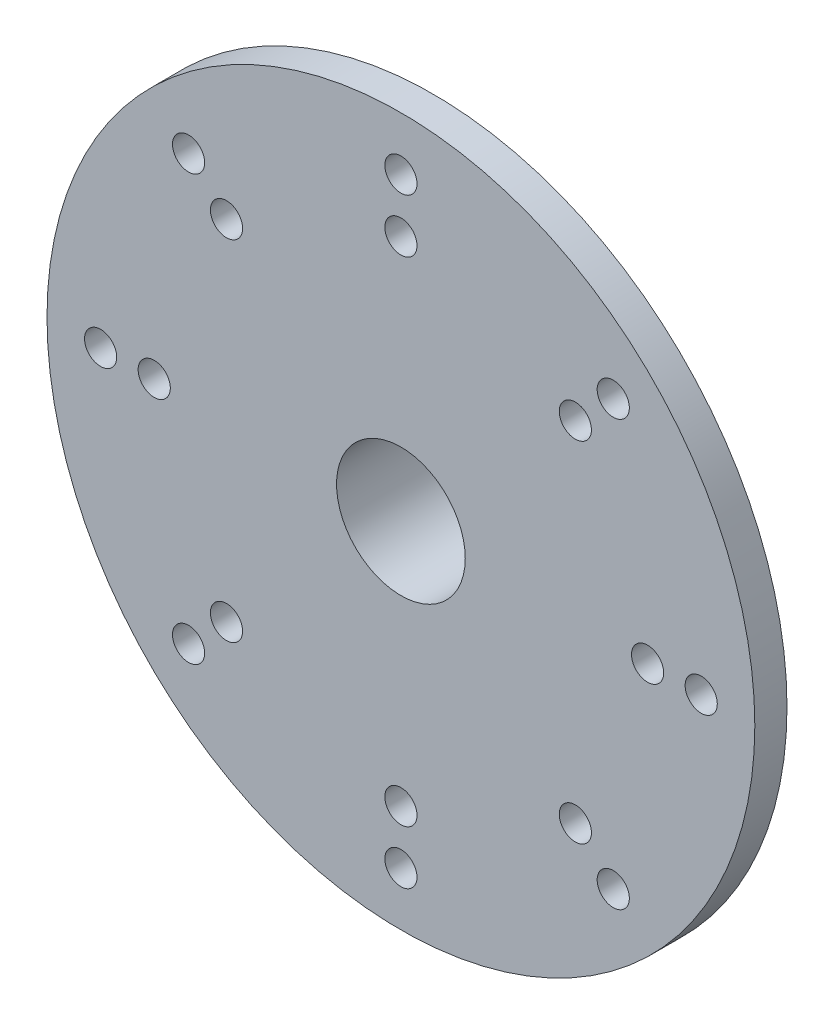
ISO-10303-21;
HEADER;
FILE_DESCRIPTION(('STEP AP214'),'2;1');
FILE_NAME('part.step','',(''),(''),'','','');
FILE_SCHEMA(('AUTOMOTIVE_DESIGN { 1 0 10303 214 1 1 1 1 }'));
ENDSEC;
DATA;
#1=APPLICATION_CONTEXT('core data for automotive mechanical design processes');
#2=APPLICATION_PROTOCOL_DEFINITION('international standard','automotive_design',2000,#1);
#3=PRODUCT_CONTEXT('',#1,'mechanical');
#4=PRODUCT('Part','Part','',(#3));
#5=PRODUCT_RELATED_PRODUCT_CATEGORY('part','',(#4));
#6=PRODUCT_DEFINITION_FORMATION('','',#4);
#7=PRODUCT_DEFINITION_CONTEXT('part definition',#1,'design');
#8=PRODUCT_DEFINITION('design','',#6,#7);
#9=PRODUCT_DEFINITION_SHAPE('','',#8);
#10=(LENGTH_UNIT() NAMED_UNIT(*) SI_UNIT(.MILLI.,.METRE.));
#11=(NAMED_UNIT(*) PLANE_ANGLE_UNIT() SI_UNIT($,.RADIAN.));
#12=(NAMED_UNIT(*) SI_UNIT($,.STERADIAN.) SOLID_ANGLE_UNIT());
#13=UNCERTAINTY_MEASURE_WITH_UNIT(LENGTH_MEASURE(1.E-05),#10,'distance_accuracy_value','');
#14=(GEOMETRIC_REPRESENTATION_CONTEXT(3) GLOBAL_UNCERTAINTY_ASSIGNED_CONTEXT((#13)) GLOBAL_UNIT_ASSIGNED_CONTEXT((#10,
#11,#12)) REPRESENTATION_CONTEXT('',''));
#15=CARTESIAN_POINT('',(0.,0.,0.));
#16=DIRECTION('',(0.,0.,1.));
#17=DIRECTION('',(1.,0.,0.));
#18=AXIS2_PLACEMENT_3D('',#15,#16,#17);
#19=CARTESIAN_POINT('',(0.,0.,6.));
#20=DIRECTION('',(0.,0.,-1.));
#21=DIRECTION('',(-1.,0.,0.));
#22=AXIS2_PLACEMENT_3D('',#19,#20,#21);
#23=CYLINDRICAL_SURFACE('',#22,4.);
#24=CARTESIAN_POINT('',(0.,0.,0.));
#25=DIRECTION('',(0.,0.,1.));
#26=DIRECTION('',(1.,0.,0.));
#27=AXIS2_PLACEMENT_3D('',#24,#25,#26);
#28=CIRCLE('',#27,4.);
#29=CARTESIAN_POINT('',(4.,0.,0.));
#30=VERTEX_POINT('',#29);
#31=EDGE_CURVE('E36',#30,#30,#28,.T.);
#32=ORIENTED_EDGE('',*,*,#31,.T.);
#33=EDGE_LOOP('',(#32));
#34=FACE_BOUND('',#33,.T.);
#35=CARTESIAN_POINT('',(0.,0.,4.5));
#36=DIRECTION('',(0.,0.,1.));
#37=DIRECTION('',(1.,0.,0.));
#38=AXIS2_PLACEMENT_3D('',#35,#36,#37);
#39=CIRCLE('',#38,4.);
#40=CARTESIAN_POINT('',(4.,0.,4.5));
#41=VERTEX_POINT('',#40);
#42=EDGE_CURVE('E10',#41,#41,#39,.T.);
#43=ORIENTED_EDGE('',*,*,#42,.F.);
#44=EDGE_LOOP('',(#43));
#45=FACE_BOUND('',#44,.T.);
#46=ADVANCED_FACE('F30',(#34,#45),#23,.T.);
#47=CARTESIAN_POINT('',(0.,0.,6.));
#48=DIRECTION('',(0.,0.,1.));
#49=DIRECTION('',(1.,0.,0.));
#50=AXIS2_PLACEMENT_3D('',#47,#48,#49);
#51=PLANE('',#50);
#52=CARTESIAN_POINT('',(8.1317279836452,8.1317279836454,6.));
#53=DIRECTION('',(0.,0.,1.));
#54=DIRECTION('',(0.707106781186556,-0.707106781186539,0.));
#55=AXIS2_PLACEMENT_3D('',#52,#53,#54);
#56=CIRCLE('',#55,0.75);
#57=CARTESIAN_POINT('',(8.66205806953511,7.60139789775549,6.));
#58=VERTEX_POINT('',#57);
#59=EDGE_CURVE('E110',#58,#58,#56,.T.);
#60=ORIENTED_EDGE('',*,*,#59,.F.);
#61=EDGE_LOOP('',(#60));
#62=FACE_BOUND('',#61,.T.);
#63=CARTESIAN_POINT('',(9.89949493661154,9.89949493661179,6.));
#64=DIRECTION('',(0.,0.,1.));
#65=DIRECTION('',(0.707106781186556,-0.707106781186539,0.));
#66=AXIS2_PLACEMENT_3D('',#63,#64,#65);
#67=CIRCLE('',#66,0.75);
#68=CARTESIAN_POINT('',(10.4298250225015,9.36916485072188,6.));
#69=VERTEX_POINT('',#68);
#70=EDGE_CURVE('E116',#69,#69,#67,.T.);
#71=ORIENTED_EDGE('',*,*,#70,.F.);
#72=EDGE_LOOP('',(#71));
#73=FACE_BOUND('',#72,.T.);
#74=CARTESIAN_POINT('',(11.5,1.19680994356983E-13,6.));
#75=DIRECTION('',(0.,0.,1.));
#76=DIRECTION('',(0.,-1.,0.));
#77=AXIS2_PLACEMENT_3D('',#74,#75,#76);
#78=CIRCLE('',#77,0.75);
#79=CARTESIAN_POINT('',(11.5,-0.749999999999881,6.));
#80=VERTEX_POINT('',#79);
#81=EDGE_CURVE('E122',#80,#80,#78,.T.);
#82=ORIENTED_EDGE('',*,*,#81,.F.);
#83=EDGE_LOOP('',(#82));
#84=FACE_BOUND('',#83,.T.);
#85=CARTESIAN_POINT('',(14.,1.46173266098093E-13,6.));
#86=DIRECTION('',(0.,0.,1.));
#87=DIRECTION('',(0.,-1.,0.));
#88=AXIS2_PLACEMENT_3D('',#85,#86,#87);
#89=CIRCLE('',#88,0.75);
#90=CARTESIAN_POINT('',(14.,-0.749999999999854,6.));
#91=VERTEX_POINT('',#90);
#92=EDGE_CURVE('E128',#91,#91,#89,.T.);
#93=ORIENTED_EDGE('',*,*,#92,.F.);
#94=EDGE_LOOP('',(#93));
#95=FACE_BOUND('',#94,.T.);
#96=CARTESIAN_POINT('',(8.13172798364537,-8.13172798364523,6.));
#97=DIRECTION('',(0.,0.,1.));
#98=DIRECTION('',(-0.707106781186541,-0.707106781186554,0.));
#99=AXIS2_PLACEMENT_3D('',#96,#97,#98);
#100=CIRCLE('',#99,0.75);
#101=CARTESIAN_POINT('',(7.60139789775546,-8.66205806953514,6.));
#102=VERTEX_POINT('',#101);
#103=EDGE_CURVE('E134',#102,#102,#100,.T.);
#104=ORIENTED_EDGE('',*,*,#103,.F.);
#105=EDGE_LOOP('',(#104));
#106=FACE_BOUND('',#105,.T.);
#107=CARTESIAN_POINT('',(9.89949493661175,-9.89949493661158,6.));
#108=DIRECTION('',(0.,0.,1.));
#109=DIRECTION('',(-0.707106781186541,-0.707106781186554,0.));
#110=AXIS2_PLACEMENT_3D('',#107,#108,#109);
#111=CIRCLE('',#110,0.75);
#112=CARTESIAN_POINT('',(9.36916485072185,-10.4298250225015,6.));
#113=VERTEX_POINT('',#112);
#114=EDGE_CURVE('E140',#113,#113,#111,.T.);
#115=ORIENTED_EDGE('',*,*,#114,.F.);
#116=EDGE_LOOP('',(#115));
#117=FACE_BOUND('',#116,.T.);
#118=CARTESIAN_POINT('',(0.,-11.5,6.));
#119=DIRECTION('',(0.,0.,1.));
#120=DIRECTION('',(-1.,0.,0.));
#121=AXIS2_PLACEMENT_3D('',#118,#119,#120);
#122=CIRCLE('',#121,0.75);
#123=CARTESIAN_POINT('',(-0.750000000000001,-11.5,6.));
#124=VERTEX_POINT('',#123);
#125=EDGE_CURVE('E146',#124,#124,#122,.T.);
#126=ORIENTED_EDGE('',*,*,#125,.F.);
#127=EDGE_LOOP('',(#126));
#128=FACE_BOUND('',#127,.T.);
#129=CARTESIAN_POINT('',(0.,-14.,6.));
#130=DIRECTION('',(0.,0.,1.));
#131=DIRECTION('',(-1.,0.,0.));
#132=AXIS2_PLACEMENT_3D('',#129,#130,#131);
#133=CIRCLE('',#132,0.75);
#134=CARTESIAN_POINT('',(-0.750000000000001,-14.,6.));
#135=VERTEX_POINT('',#134);
#136=EDGE_CURVE('E74',#135,#135,#133,.T.);
#137=ORIENTED_EDGE('',*,*,#136,.F.);
#138=EDGE_LOOP('',(#137));
#139=FACE_BOUND('',#138,.T.);
#140=CARTESIAN_POINT('',(-8.13172798364525,-8.13172798364534,6.));
#141=DIRECTION('',(0.,0.,1.));
#142=DIRECTION('',(-0.707106781186551,0.707106781186544,0.));
#143=AXIS2_PLACEMENT_3D('',#140,#141,#142);
#144=CIRCLE('',#143,0.75);
#145=CARTESIAN_POINT('',(-8.66205806953517,-7.60139789775543,6.));
#146=VERTEX_POINT('',#145);
#147=EDGE_CURVE('E81',#146,#146,#144,.T.);
#148=ORIENTED_EDGE('',*,*,#147,.F.);
#149=EDGE_LOOP('',(#148));
#150=FACE_BOUND('',#149,.T.);
#151=CARTESIAN_POINT('',(-9.89949493661161,-9.89949493661172,6.));
#152=DIRECTION('',(0.,0.,1.));
#153=DIRECTION('',(-0.707106781186551,0.707106781186544,0.));
#154=AXIS2_PLACEMENT_3D('',#151,#152,#153);
#155=CIRCLE('',#154,0.75);
#156=CARTESIAN_POINT('',(-10.4298250225015,-9.36916485072181,6.));
#157=VERTEX_POINT('',#156);
#158=EDGE_CURVE('E87',#157,#157,#155,.T.);
#159=ORIENTED_EDGE('',*,*,#158,.F.);
#160=EDGE_LOOP('',(#159));
#161=FACE_BOUND('',#160,.T.);
#162=CARTESIAN_POINT('',(-11.5,0.,6.));
#163=DIRECTION('',(0.,0.,1.));
#164=DIRECTION('',(0.,1.,0.));
#165=AXIS2_PLACEMENT_3D('',#162,#163,#164);
#166=CIRCLE('',#165,0.75);
#167=CARTESIAN_POINT('',(-11.5,0.749999999999961,6.));
#168=VERTEX_POINT('',#167);
#169=EDGE_CURVE('E93',#168,#168,#166,.T.);
#170=ORIENTED_EDGE('',*,*,#169,.F.);
#171=EDGE_LOOP('',(#170));
#172=FACE_BOUND('',#171,.T.);
#173=CARTESIAN_POINT('',(-14.,0.,6.));
#174=DIRECTION('',(0.,0.,1.));
#175=DIRECTION('',(0.,1.,0.));
#176=AXIS2_PLACEMENT_3D('',#173,#174,#175);
#177=CIRCLE('',#176,0.75);
#178=CARTESIAN_POINT('',(-14.,0.749999999999952,6.));
#179=VERTEX_POINT('',#178);
#180=EDGE_CURVE('E99',#179,#179,#177,.T.);
#181=ORIENTED_EDGE('',*,*,#180,.F.);
#182=EDGE_LOOP('',(#181));
#183=FACE_BOUND('',#182,.T.);
#184=CARTESIAN_POINT('',(-8.13172798364531,8.13172798364528,6.));
#185=DIRECTION('',(0.,0.,1.));
#186=DIRECTION('',(0.707106781186546,0.707106781186549,0.));
#187=AXIS2_PLACEMENT_3D('',#184,#185,#186);
#188=CIRCLE('',#187,0.75);
#189=CARTESIAN_POINT('',(-7.6013978977554,8.6620580695352,6.));
#190=VERTEX_POINT('',#189);
#191=EDGE_CURVE('E105',#190,#190,#188,.T.);
#192=ORIENTED_EDGE('',*,*,#191,.F.);
#193=EDGE_LOOP('',(#192));
#194=FACE_BOUND('',#193,.T.);
#195=CARTESIAN_POINT('',(-9.89949493661168,9.89949493661165,6.));
#196=DIRECTION('',(0.,0.,1.));
#197=DIRECTION('',(0.707106781186546,0.707106781186549,0.));
#198=AXIS2_PLACEMENT_3D('',#195,#196,#197);
#199=CIRCLE('',#198,0.75);
#200=CARTESIAN_POINT('',(-9.36916485072177,10.4298250225016,6.));
#201=VERTEX_POINT('',#200);
#202=EDGE_CURVE('E68',#201,#201,#199,.T.);
#203=ORIENTED_EDGE('',*,*,#202,.F.);
#204=EDGE_LOOP('',(#203));
#205=FACE_BOUND('',#204,.T.);
#206=CARTESIAN_POINT('',(0.,11.5,6.));
#207=DIRECTION('',(0.,0.,1.));
#208=DIRECTION('',(1.,0.,0.));
#209=AXIS2_PLACEMENT_3D('',#206,#207,#208);
#210=CIRCLE('',#209,0.75);
#211=CARTESIAN_POINT('',(0.750000000000001,11.5,6.));
#212=VERTEX_POINT('',#211);
#213=EDGE_CURVE('E62',#212,#212,#210,.T.);
#214=ORIENTED_EDGE('',*,*,#213,.F.);
#215=EDGE_LOOP('',(#214));
#216=FACE_BOUND('',#215,.T.);
#217=CARTESIAN_POINT('',(0.,14.,6.));
#218=DIRECTION('',(0.,0.,1.));
#219=DIRECTION('',(1.,0.,0.));
#220=AXIS2_PLACEMENT_3D('',#217,#218,#219);
#221=CIRCLE('',#220,0.75);
#222=CARTESIAN_POINT('',(0.750000000000001,14.,6.));
#223=VERTEX_POINT('',#222);
#224=EDGE_CURVE('E56',#223,#223,#221,.T.);
#225=ORIENTED_EDGE('',*,*,#224,.F.);
#226=EDGE_LOOP('',(#225));
#227=FACE_BOUND('',#226,.T.);
#228=CARTESIAN_POINT('',(0.,0.,6.));
#229=DIRECTION('',(0.,0.,1.));
#230=DIRECTION('',(1.,0.,0.));
#231=AXIS2_PLACEMENT_3D('',#228,#229,#230);
#232=CIRCLE('',#231,3.);
#233=CARTESIAN_POINT('',(3.,0.,6.));
#234=VERTEX_POINT('',#233);
#235=EDGE_CURVE('E40',#234,#234,#232,.T.);
#236=ORIENTED_EDGE('',*,*,#235,.F.);
#237=EDGE_LOOP('',(#236));
#238=FACE_BOUND('',#237,.T.);
#239=CARTESIAN_POINT('',(0.,0.,6.));
#240=DIRECTION('',(0.,0.,1.));
#241=DIRECTION('',(1.,0.,0.));
#242=AXIS2_PLACEMENT_3D('',#239,#240,#241);
#243=CIRCLE('',#242,16.5);
#244=CARTESIAN_POINT('',(16.5,0.,6.));
#245=VERTEX_POINT('',#244);
#246=EDGE_CURVE('E50',#245,#245,#243,.T.);
#247=ORIENTED_EDGE('',*,*,#246,.T.);
#248=EDGE_LOOP('',(#247));
#249=FACE_BOUND('',#248,.T.);
#250=ADVANCED_FACE('F163',(#62,#73,#84,#95,#106,#117,#128,#139,#150,#161,#172,#183,#194,#205,
#216,#227,#238,#249),#51,.T.);
#251=CARTESIAN_POINT('',(0.,0.,0.));
#252=DIRECTION('',(0.,0.,1.));
#253=DIRECTION('',(1.,0.,0.));
#254=AXIS2_PLACEMENT_3D('',#251,#252,#253);
#255=PLANE('',#254);
#256=ORIENTED_EDGE('',*,*,#31,.F.);
#257=EDGE_LOOP('',(#256));
#258=FACE_BOUND('',#257,.T.);
#259=CARTESIAN_POINT('',(0.,0.,0.));
#260=DIRECTION('',(0.,0.,1.));
#261=DIRECTION('',(1.,0.,0.));
#262=AXIS2_PLACEMENT_3D('',#259,#260,#261);
#263=CIRCLE('',#262,3.);
#264=CARTESIAN_POINT('',(3.,0.,0.));
#265=VERTEX_POINT('',#264);
#266=EDGE_CURVE('E44',#265,#265,#263,.T.);
#267=ORIENTED_EDGE('',*,*,#266,.T.);
#268=EDGE_LOOP('',(#267));
#269=FACE_BOUND('',#268,.T.);
#270=ADVANCED_FACE('F166',(#258,#269),#255,.F.);
#271=CARTESIAN_POINT('',(0.,0.,6.));
#272=DIRECTION('',(0.,0.,-1.));
#273=DIRECTION('',(-1.,0.,0.));
#274=AXIS2_PLACEMENT_3D('',#271,#272,#273);
#275=CYLINDRICAL_SURFACE('',#274,3.);
#276=ORIENTED_EDGE('',*,*,#235,.T.);
#277=EDGE_LOOP('',(#276));
#278=FACE_BOUND('',#277,.T.);
#279=ORIENTED_EDGE('',*,*,#266,.F.);
#280=EDGE_LOOP('',(#279));
#281=FACE_BOUND('',#280,.T.);
#282=ADVANCED_FACE('F193',(#278,#281),#275,.F.);
#283=CARTESIAN_POINT('',(0.,0.,4.5));
#284=DIRECTION('',(0.,0.,1.));
#285=DIRECTION('',(1.,0.,0.));
#286=AXIS2_PLACEMENT_3D('',#283,#284,#285);
#287=CYLINDRICAL_SURFACE('',#286,16.5);
#288=CARTESIAN_POINT('',(0.,0.,4.5));
#289=DIRECTION('',(0.,0.,1.));
#290=DIRECTION('',(1.,0.,0.));
#291=AXIS2_PLACEMENT_3D('',#288,#289,#290);
#292=CIRCLE('',#291,16.5);
#293=CARTESIAN_POINT('',(16.5,0.,4.5));
#294=VERTEX_POINT('',#293);
#295=EDGE_CURVE('E48',#294,#294,#292,.T.);
#296=ORIENTED_EDGE('',*,*,#295,.T.);
#297=EDGE_LOOP('',(#296));
#298=FACE_BOUND('',#297,.T.);
#299=ORIENTED_EDGE('',*,*,#246,.F.);
#300=EDGE_LOOP('',(#299));
#301=FACE_BOUND('',#300,.T.);
#302=ADVANCED_FACE('F191',(#298,#301),#287,.T.);
#303=CARTESIAN_POINT('',(0.,0.,4.5));
#304=DIRECTION('',(0.,0.,1.));
#305=DIRECTION('',(1.,0.,0.));
#306=AXIS2_PLACEMENT_3D('',#303,#304,#305);
#307=PLANE('',#306);
#308=CARTESIAN_POINT('',(8.1317279836452,8.1317279836454,4.5));
#309=DIRECTION('',(0.,0.,1.));
#310=DIRECTION('',(0.707106781186556,-0.707106781186539,0.));
#311=AXIS2_PLACEMENT_3D('',#308,#309,#310);
#312=CIRCLE('',#311,0.75);
#313=CARTESIAN_POINT('',(8.66205806953511,7.60139789775549,4.5));
#314=VERTEX_POINT('',#313);
#315=EDGE_CURVE('E113',#314,#314,#312,.T.);
#316=ORIENTED_EDGE('',*,*,#315,.T.);
#317=EDGE_LOOP('',(#316));
#318=FACE_BOUND('',#317,.T.);
#319=CARTESIAN_POINT('',(9.89949493661154,9.89949493661179,4.5));
#320=DIRECTION('',(0.,0.,1.));
#321=DIRECTION('',(0.707106781186556,-0.707106781186539,0.));
#322=AXIS2_PLACEMENT_3D('',#319,#320,#321);
#323=CIRCLE('',#322,0.75);
#324=CARTESIAN_POINT('',(10.4298250225015,9.36916485072188,4.5));
#325=VERTEX_POINT('',#324);
#326=EDGE_CURVE('E119',#325,#325,#323,.T.);
#327=ORIENTED_EDGE('',*,*,#326,.T.);
#328=EDGE_LOOP('',(#327));
#329=FACE_BOUND('',#328,.T.);
#330=CARTESIAN_POINT('',(11.5,1.19680994356983E-13,4.5));
#331=DIRECTION('',(0.,0.,1.));
#332=DIRECTION('',(0.,-1.,0.));
#333=AXIS2_PLACEMENT_3D('',#330,#331,#332);
#334=CIRCLE('',#333,0.75);
#335=CARTESIAN_POINT('',(11.5,-0.749999999999881,4.5));
#336=VERTEX_POINT('',#335);
#337=EDGE_CURVE('E125',#336,#336,#334,.T.);
#338=ORIENTED_EDGE('',*,*,#337,.T.);
#339=EDGE_LOOP('',(#338));
#340=FACE_BOUND('',#339,.T.);
#341=CARTESIAN_POINT('',(14.,1.46173266098093E-13,4.5));
#342=DIRECTION('',(0.,0.,1.));
#343=DIRECTION('',(0.,-1.,0.));
#344=AXIS2_PLACEMENT_3D('',#341,#342,#343);
#345=CIRCLE('',#344,0.75);
#346=CARTESIAN_POINT('',(14.,-0.749999999999854,4.5));
#347=VERTEX_POINT('',#346);
#348=EDGE_CURVE('E131',#347,#347,#345,.T.);
#349=ORIENTED_EDGE('',*,*,#348,.T.);
#350=EDGE_LOOP('',(#349));
#351=FACE_BOUND('',#350,.T.);
#352=CARTESIAN_POINT('',(8.13172798364537,-8.13172798364523,4.5));
#353=DIRECTION('',(0.,0.,1.));
#354=DIRECTION('',(-0.707106781186541,-0.707106781186554,0.));
#355=AXIS2_PLACEMENT_3D('',#352,#353,#354);
#356=CIRCLE('',#355,0.75);
#357=CARTESIAN_POINT('',(7.60139789775546,-8.66205806953514,4.5));
#358=VERTEX_POINT('',#357);
#359=EDGE_CURVE('E137',#358,#358,#356,.T.);
#360=ORIENTED_EDGE('',*,*,#359,.T.);
#361=EDGE_LOOP('',(#360));
#362=FACE_BOUND('',#361,.T.);
#363=CARTESIAN_POINT('',(9.89949493661175,-9.89949493661158,4.5));
#364=DIRECTION('',(0.,0.,1.));
#365=DIRECTION('',(-0.707106781186541,-0.707106781186554,0.));
#366=AXIS2_PLACEMENT_3D('',#363,#364,#365);
#367=CIRCLE('',#366,0.75);
#368=CARTESIAN_POINT('',(9.36916485072185,-10.4298250225015,4.5));
#369=VERTEX_POINT('',#368);
#370=EDGE_CURVE('E143',#369,#369,#367,.T.);
#371=ORIENTED_EDGE('',*,*,#370,.T.);
#372=EDGE_LOOP('',(#371));
#373=FACE_BOUND('',#372,.T.);
#374=CARTESIAN_POINT('',(0.,-11.5,4.5));
#375=DIRECTION('',(0.,0.,1.));
#376=DIRECTION('',(-1.,0.,0.));
#377=AXIS2_PLACEMENT_3D('',#374,#375,#376);
#378=CIRCLE('',#377,0.75);
#379=CARTESIAN_POINT('',(-0.750000000000001,-11.5,4.5));
#380=VERTEX_POINT('',#379);
#381=EDGE_CURVE('E78',#380,#380,#378,.T.);
#382=ORIENTED_EDGE('',*,*,#381,.T.);
#383=EDGE_LOOP('',(#382));
#384=FACE_BOUND('',#383,.T.);
#385=CARTESIAN_POINT('',(0.,-14.,4.5));
#386=DIRECTION('',(0.,0.,1.));
#387=DIRECTION('',(-1.,0.,0.));
#388=AXIS2_PLACEMENT_3D('',#385,#386,#387);
#389=CIRCLE('',#388,0.75);
#390=CARTESIAN_POINT('',(-0.750000000000001,-14.,4.5));
#391=VERTEX_POINT('',#390);
#392=EDGE_CURVE('E77',#391,#391,#389,.T.);
#393=ORIENTED_EDGE('',*,*,#392,.T.);
#394=EDGE_LOOP('',(#393));
#395=FACE_BOUND('',#394,.T.);
#396=CARTESIAN_POINT('',(-8.13172798364525,-8.13172798364534,4.5));
#397=DIRECTION('',(0.,0.,1.));
#398=DIRECTION('',(-0.707106781186551,0.707106781186544,0.));
#399=AXIS2_PLACEMENT_3D('',#396,#397,#398);
#400=CIRCLE('',#399,0.75);
#401=CARTESIAN_POINT('',(-8.66205806953517,-7.60139789775543,4.5));
#402=VERTEX_POINT('',#401);
#403=EDGE_CURVE('E84',#402,#402,#400,.T.);
#404=ORIENTED_EDGE('',*,*,#403,.T.);
#405=EDGE_LOOP('',(#404));
#406=FACE_BOUND('',#405,.T.);
#407=CARTESIAN_POINT('',(-9.89949493661161,-9.89949493661172,4.5));
#408=DIRECTION('',(0.,0.,1.));
#409=DIRECTION('',(-0.707106781186551,0.707106781186544,0.));
#410=AXIS2_PLACEMENT_3D('',#407,#408,#409);
#411=CIRCLE('',#410,0.75);
#412=CARTESIAN_POINT('',(-10.4298250225015,-9.36916485072181,4.5));
#413=VERTEX_POINT('',#412);
#414=EDGE_CURVE('E90',#413,#413,#411,.T.);
#415=ORIENTED_EDGE('',*,*,#414,.T.);
#416=EDGE_LOOP('',(#415));
#417=FACE_BOUND('',#416,.T.);
#418=CARTESIAN_POINT('',(-11.5,0.,4.5));
#419=DIRECTION('',(0.,0.,1.));
#420=DIRECTION('',(0.,1.,0.));
#421=AXIS2_PLACEMENT_3D('',#418,#419,#420);
#422=CIRCLE('',#421,0.75);
#423=CARTESIAN_POINT('',(-11.5,0.749999999999961,4.5));
#424=VERTEX_POINT('',#423);
#425=EDGE_CURVE('E96',#424,#424,#422,.T.);
#426=ORIENTED_EDGE('',*,*,#425,.T.);
#427=EDGE_LOOP('',(#426));
#428=FACE_BOUND('',#427,.T.);
#429=CARTESIAN_POINT('',(-14.,0.,4.5));
#430=DIRECTION('',(0.,0.,1.));
#431=DIRECTION('',(0.,1.,0.));
#432=AXIS2_PLACEMENT_3D('',#429,#430,#431);
#433=CIRCLE('',#432,0.75);
#434=CARTESIAN_POINT('',(-14.,0.749999999999952,4.5));
#435=VERTEX_POINT('',#434);
#436=EDGE_CURVE('E102',#435,#435,#433,.T.);
#437=ORIENTED_EDGE('',*,*,#436,.T.);
#438=EDGE_LOOP('',(#437));
#439=FACE_BOUND('',#438,.T.);
#440=CARTESIAN_POINT('',(-8.13172798364531,8.13172798364528,4.5));
#441=DIRECTION('',(0.,0.,1.));
#442=DIRECTION('',(0.707106781186546,0.707106781186549,0.));
#443=AXIS2_PLACEMENT_3D('',#440,#441,#442);
#444=CIRCLE('',#443,0.75);
#445=CARTESIAN_POINT('',(-7.6013978977554,8.6620580695352,4.5));
#446=VERTEX_POINT('',#445);
#447=EDGE_CURVE('E71',#446,#446,#444,.T.);
#448=ORIENTED_EDGE('',*,*,#447,.T.);
#449=EDGE_LOOP('',(#448));
#450=FACE_BOUND('',#449,.T.);
#451=CARTESIAN_POINT('',(-9.89949493661168,9.89949493661165,4.5));
#452=DIRECTION('',(0.,0.,1.));
#453=DIRECTION('',(0.707106781186546,0.707106781186549,0.));
#454=AXIS2_PLACEMENT_3D('',#451,#452,#453);
#455=CIRCLE('',#454,0.75);
#456=CARTESIAN_POINT('',(-9.36916485072177,10.4298250225016,4.5));
#457=VERTEX_POINT('',#456);
#458=EDGE_CURVE('E65',#457,#457,#455,.T.);
#459=ORIENTED_EDGE('',*,*,#458,.T.);
#460=EDGE_LOOP('',(#459));
#461=FACE_BOUND('',#460,.T.);
#462=CARTESIAN_POINT('',(0.,11.5,4.5));
#463=DIRECTION('',(0.,0.,1.));
#464=DIRECTION('',(1.,0.,0.));
#465=AXIS2_PLACEMENT_3D('',#462,#463,#464);
#466=CIRCLE('',#465,0.75);
#467=CARTESIAN_POINT('',(0.750000000000001,11.5,4.5));
#468=VERTEX_POINT('',#467);
#469=EDGE_CURVE('E59',#468,#468,#466,.T.);
#470=ORIENTED_EDGE('',*,*,#469,.T.);
#471=EDGE_LOOP('',(#470));
#472=FACE_BOUND('',#471,.T.);
#473=CARTESIAN_POINT('',(0.,14.,4.5));
#474=DIRECTION('',(0.,0.,1.));
#475=DIRECTION('',(1.,0.,0.));
#476=AXIS2_PLACEMENT_3D('',#473,#474,#475);
#477=CIRCLE('',#476,0.75);
#478=CARTESIAN_POINT('',(0.750000000000001,14.,4.5));
#479=VERTEX_POINT('',#478);
#480=EDGE_CURVE('E53',#479,#479,#477,.T.);
#481=ORIENTED_EDGE('',*,*,#480,.T.);
#482=EDGE_LOOP('',(#481));
#483=FACE_BOUND('',#482,.T.);
#484=ORIENTED_EDGE('',*,*,#42,.T.);
#485=EDGE_LOOP('',(#484));
#486=FACE_BOUND('',#485,.T.);
#487=ORIENTED_EDGE('',*,*,#295,.F.);
#488=EDGE_LOOP('',(#487));
#489=FACE_BOUND('',#488,.T.);
#490=ADVANCED_FACE('F152',(#318,#329,#340,#351,#362,#373,#384,#395,#406,#417,#428,#439,#450,
#461,#472,#483,#486,#489),#307,.F.);
#491=CARTESIAN_POINT('',(0.,14.,4.5));
#492=DIRECTION('',(0.,0.,1.));
#493=DIRECTION('',(1.,0.,0.));
#494=AXIS2_PLACEMENT_3D('',#491,#492,#493);
#495=CYLINDRICAL_SURFACE('',#494,0.75);
#496=ORIENTED_EDGE('',*,*,#480,.F.);
#497=EDGE_LOOP('',(#496));
#498=FACE_BOUND('',#497,.T.);
#499=ORIENTED_EDGE('',*,*,#224,.T.);
#500=EDGE_LOOP('',(#499));
#501=FACE_BOUND('',#500,.T.);
#502=ADVANCED_FACE('F200',(#498,#501),#495,.F.);
#503=CARTESIAN_POINT('',(0.,11.5,4.5));
#504=DIRECTION('',(0.,0.,1.));
#505=DIRECTION('',(1.,0.,0.));
#506=AXIS2_PLACEMENT_3D('',#503,#504,#505);
#507=CYLINDRICAL_SURFACE('',#506,0.75);
#508=ORIENTED_EDGE('',*,*,#469,.F.);
#509=EDGE_LOOP('',(#508));
#510=FACE_BOUND('',#509,.T.);
#511=ORIENTED_EDGE('',*,*,#213,.T.);
#512=EDGE_LOOP('',(#511));
#513=FACE_BOUND('',#512,.T.);
#514=ADVANCED_FACE('F253',(#510,#513),#507,.F.);
#515=CARTESIAN_POINT('',(-9.89949493661168,9.89949493661165,4.5));
#516=DIRECTION('',(0.,0.,1.));
#517=DIRECTION('',(1.,0.,0.));
#518=AXIS2_PLACEMENT_3D('',#515,#516,#517);
#519=CYLINDRICAL_SURFACE('',#518,0.75);
#520=ORIENTED_EDGE('',*,*,#458,.F.);
#521=EDGE_LOOP('',(#520));
#522=FACE_BOUND('',#521,.T.);
#523=ORIENTED_EDGE('',*,*,#202,.T.);
#524=EDGE_LOOP('',(#523));
#525=FACE_BOUND('',#524,.T.);
#526=ADVANCED_FACE('F261',(#522,#525),#519,.F.);
#527=CARTESIAN_POINT('',(-8.13172798364531,8.13172798364528,4.5));
#528=DIRECTION('',(0.,0.,1.));
#529=DIRECTION('',(1.,0.,0.));
#530=AXIS2_PLACEMENT_3D('',#527,#528,#529);
#531=CYLINDRICAL_SURFACE('',#530,0.75);
#532=ORIENTED_EDGE('',*,*,#447,.F.);
#533=EDGE_LOOP('',(#532));
#534=FACE_BOUND('',#533,.T.);
#535=ORIENTED_EDGE('',*,*,#191,.T.);
#536=EDGE_LOOP('',(#535));
#537=FACE_BOUND('',#536,.T.);
#538=ADVANCED_FACE('F269',(#534,#537),#531,.F.);
#539=CARTESIAN_POINT('',(-14.,0.,4.5));
#540=DIRECTION('',(0.,0.,1.));
#541=DIRECTION('',(1.,0.,0.));
#542=AXIS2_PLACEMENT_3D('',#539,#540,#541);
#543=CYLINDRICAL_SURFACE('',#542,0.75);
#544=ORIENTED_EDGE('',*,*,#436,.F.);
#545=EDGE_LOOP('',(#544));
#546=FACE_BOUND('',#545,.T.);
#547=ORIENTED_EDGE('',*,*,#180,.T.);
#548=EDGE_LOOP('',(#547));
#549=FACE_BOUND('',#548,.T.);
#550=ADVANCED_FACE('F278',(#546,#549),#543,.F.);
#551=CARTESIAN_POINT('',(-11.5,0.,4.5));
#552=DIRECTION('',(0.,0.,1.));
#553=DIRECTION('',(1.,0.,0.));
#554=AXIS2_PLACEMENT_3D('',#551,#552,#553);
#555=CYLINDRICAL_SURFACE('',#554,0.75);
#556=ORIENTED_EDGE('',*,*,#425,.F.);
#557=EDGE_LOOP('',(#556));
#558=FACE_BOUND('',#557,.T.);
#559=ORIENTED_EDGE('',*,*,#169,.T.);
#560=EDGE_LOOP('',(#559));
#561=FACE_BOUND('',#560,.T.);
#562=ADVANCED_FACE('F287',(#558,#561),#555,.F.);
#563=CARTESIAN_POINT('',(-9.89949493661161,-9.89949493661172,4.5));
#564=DIRECTION('',(0.,0.,1.));
#565=DIRECTION('',(1.,0.,0.));
#566=AXIS2_PLACEMENT_3D('',#563,#564,#565);
#567=CYLINDRICAL_SURFACE('',#566,0.75);
#568=ORIENTED_EDGE('',*,*,#414,.F.);
#569=EDGE_LOOP('',(#568));
#570=FACE_BOUND('',#569,.T.);
#571=ORIENTED_EDGE('',*,*,#158,.T.);
#572=EDGE_LOOP('',(#571));
#573=FACE_BOUND('',#572,.T.);
#574=ADVANCED_FACE('F296',(#570,#573),#567,.F.);
#575=CARTESIAN_POINT('',(-8.13172798364525,-8.13172798364534,4.5));
#576=DIRECTION('',(0.,0.,1.));
#577=DIRECTION('',(1.,0.,0.));
#578=AXIS2_PLACEMENT_3D('',#575,#576,#577);
#579=CYLINDRICAL_SURFACE('',#578,0.75);
#580=ORIENTED_EDGE('',*,*,#403,.F.);
#581=EDGE_LOOP('',(#580));
#582=FACE_BOUND('',#581,.T.);
#583=ORIENTED_EDGE('',*,*,#147,.T.);
#584=EDGE_LOOP('',(#583));
#585=FACE_BOUND('',#584,.T.);
#586=ADVANCED_FACE('F305',(#582,#585),#579,.F.);
#587=CARTESIAN_POINT('',(0.,-14.,4.5));
#588=DIRECTION('',(0.,0.,1.));
#589=DIRECTION('',(1.,0.,0.));
#590=AXIS2_PLACEMENT_3D('',#587,#588,#589);
#591=CYLINDRICAL_SURFACE('',#590,0.75);
#592=ORIENTED_EDGE('',*,*,#392,.F.);
#593=EDGE_LOOP('',(#592));
#594=FACE_BOUND('',#593,.T.);
#595=ORIENTED_EDGE('',*,*,#136,.T.);
#596=EDGE_LOOP('',(#595));
#597=FACE_BOUND('',#596,.T.);
#598=ADVANCED_FACE('F159',(#594,#597),#591,.F.);
#599=CARTESIAN_POINT('',(0.,-11.5,4.5));
#600=DIRECTION('',(0.,0.,1.));
#601=DIRECTION('',(1.,0.,0.));
#602=AXIS2_PLACEMENT_3D('',#599,#600,#601);
#603=CYLINDRICAL_SURFACE('',#602,0.75);
#604=ORIENTED_EDGE('',*,*,#381,.F.);
#605=EDGE_LOOP('',(#604));
#606=FACE_BOUND('',#605,.T.);
#607=ORIENTED_EDGE('',*,*,#125,.T.);
#608=EDGE_LOOP('',(#607));
#609=FACE_BOUND('',#608,.T.);
#610=ADVANCED_FACE('F155',(#606,#609),#603,.F.);
#611=CARTESIAN_POINT('',(9.89949493661175,-9.89949493661158,4.5));
#612=DIRECTION('',(0.,0.,1.));
#613=DIRECTION('',(1.,0.,0.));
#614=AXIS2_PLACEMENT_3D('',#611,#612,#613);
#615=CYLINDRICAL_SURFACE('',#614,0.75);
#616=ORIENTED_EDGE('',*,*,#370,.F.);
#617=EDGE_LOOP('',(#616));
#618=FACE_BOUND('',#617,.T.);
#619=ORIENTED_EDGE('',*,*,#114,.T.);
#620=EDGE_LOOP('',(#619));
#621=FACE_BOUND('',#620,.T.);
#622=ADVANCED_FACE('F158',(#618,#621),#615,.F.);
#623=CARTESIAN_POINT('',(8.13172798364537,-8.13172798364523,4.5));
#624=DIRECTION('',(0.,0.,1.));
#625=DIRECTION('',(1.,0.,0.));
#626=AXIS2_PLACEMENT_3D('',#623,#624,#625);
#627=CYLINDRICAL_SURFACE('',#626,0.75);
#628=ORIENTED_EDGE('',*,*,#359,.F.);
#629=EDGE_LOOP('',(#628));
#630=FACE_BOUND('',#629,.T.);
#631=ORIENTED_EDGE('',*,*,#103,.T.);
#632=EDGE_LOOP('',(#631));
#633=FACE_BOUND('',#632,.T.);
#634=ADVANCED_FACE('F335',(#630,#633),#627,.F.);
#635=CARTESIAN_POINT('',(14.,1.46173266098093E-13,4.5));
#636=DIRECTION('',(0.,0.,1.));
#637=DIRECTION('',(1.,0.,0.));
#638=AXIS2_PLACEMENT_3D('',#635,#636,#637);
#639=CYLINDRICAL_SURFACE('',#638,0.75);
#640=ORIENTED_EDGE('',*,*,#348,.F.);
#641=EDGE_LOOP('',(#640));
#642=FACE_BOUND('',#641,.T.);
#643=ORIENTED_EDGE('',*,*,#92,.T.);
#644=EDGE_LOOP('',(#643));
#645=FACE_BOUND('',#644,.T.);
#646=ADVANCED_FACE('F344',(#642,#645),#639,.F.);
#647=CARTESIAN_POINT('',(11.5,1.19680994356983E-13,4.5));
#648=DIRECTION('',(0.,0.,1.));
#649=DIRECTION('',(1.,0.,0.));
#650=AXIS2_PLACEMENT_3D('',#647,#648,#649);
#651=CYLINDRICAL_SURFACE('',#650,0.75);
#652=ORIENTED_EDGE('',*,*,#337,.F.);
#653=EDGE_LOOP('',(#652));
#654=FACE_BOUND('',#653,.T.);
#655=ORIENTED_EDGE('',*,*,#81,.T.);
#656=EDGE_LOOP('',(#655));
#657=FACE_BOUND('',#656,.T.);
#658=ADVANCED_FACE('F353',(#654,#657),#651,.F.);
#659=CARTESIAN_POINT('',(9.89949493661154,9.89949493661179,4.5));
#660=DIRECTION('',(0.,0.,1.));
#661=DIRECTION('',(1.,0.,0.));
#662=AXIS2_PLACEMENT_3D('',#659,#660,#661);
#663=CYLINDRICAL_SURFACE('',#662,0.75);
#664=ORIENTED_EDGE('',*,*,#326,.F.);
#665=EDGE_LOOP('',(#664));
#666=FACE_BOUND('',#665,.T.);
#667=ORIENTED_EDGE('',*,*,#70,.T.);
#668=EDGE_LOOP('',(#667));
#669=FACE_BOUND('',#668,.T.);
#670=ADVANCED_FACE('F362',(#666,#669),#663,.F.);
#671=CARTESIAN_POINT('',(8.1317279836452,8.1317279836454,4.5));
#672=DIRECTION('',(0.,0.,1.));
#673=DIRECTION('',(1.,0.,0.));
#674=AXIS2_PLACEMENT_3D('',#671,#672,#673);
#675=CYLINDRICAL_SURFACE('',#674,0.75);
#676=ORIENTED_EDGE('',*,*,#315,.F.);
#677=EDGE_LOOP('',(#676));
#678=FACE_BOUND('',#677,.T.);
#679=ORIENTED_EDGE('',*,*,#59,.T.);
#680=EDGE_LOOP('',(#679));
#681=FACE_BOUND('',#680,.T.);
#682=ADVANCED_FACE('F371',(#678,#681),#675,.F.);
#683=CLOSED_SHELL('',(#46,#250,#270,#282,#302,#490,#502,#514,#526,#538,#550,#562,#574,#586,#598,
#610,#622,#634,#646,#658,#670,#682));
#684=MANIFOLD_SOLID_BREP('B2',#683);
#685=ADVANCED_BREP_SHAPE_REPRESENTATION('',(#18,#684),#14);
#686=SHAPE_DEFINITION_REPRESENTATION(#9,#685);
ENDSEC;
END-ISO-10303-21;
